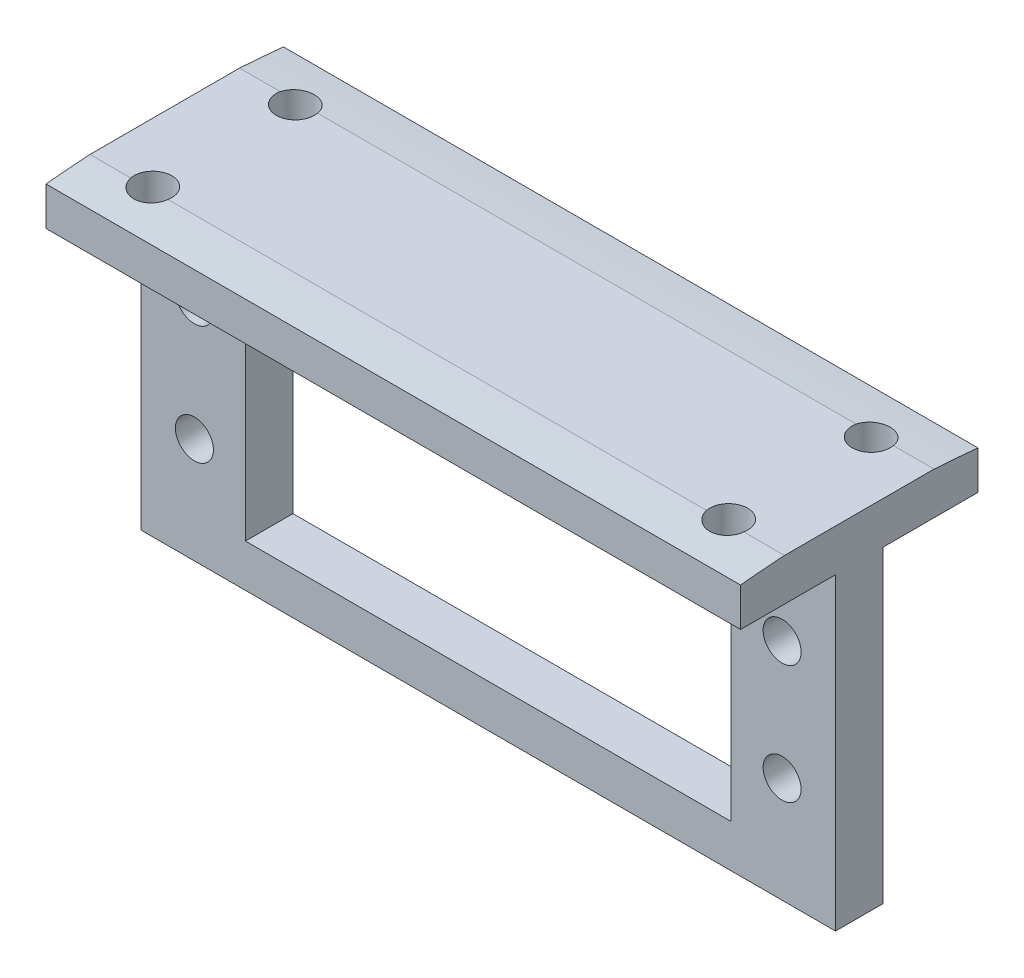
ISO-10303-21;
HEADER;
FILE_DESCRIPTION(('STEP AP214'),'2;1');
FILE_NAME('part.step','',(''),(''),'','','');
FILE_SCHEMA(('AUTOMOTIVE_DESIGN { 1 0 10303 214 1 1 1 1 }'));
ENDSEC;
DATA;
#1=APPLICATION_CONTEXT('core data for automotive mechanical design processes');
#2=APPLICATION_PROTOCOL_DEFINITION('international standard','automotive_design',2000,#1);
#3=PRODUCT_CONTEXT('',#1,'mechanical');
#4=PRODUCT('Part','Part','',(#3));
#5=PRODUCT_RELATED_PRODUCT_CATEGORY('part','',(#4));
#6=PRODUCT_DEFINITION_FORMATION('','',#4);
#7=PRODUCT_DEFINITION_CONTEXT('part definition',#1,'design');
#8=PRODUCT_DEFINITION('design','',#6,#7);
#9=PRODUCT_DEFINITION_SHAPE('','',#8);
#10=(LENGTH_UNIT() NAMED_UNIT(*) SI_UNIT(.MILLI.,.METRE.));
#11=(NAMED_UNIT(*) PLANE_ANGLE_UNIT() SI_UNIT($,.RADIAN.));
#12=(NAMED_UNIT(*) SI_UNIT($,.STERADIAN.) SOLID_ANGLE_UNIT());
#13=UNCERTAINTY_MEASURE_WITH_UNIT(LENGTH_MEASURE(1.E-05),#10,'distance_accuracy_value','');
#14=(GEOMETRIC_REPRESENTATION_CONTEXT(3) GLOBAL_UNCERTAINTY_ASSIGNED_CONTEXT((#13)) GLOBAL_UNIT_ASSIGNED_CONTEXT((#10,
#11,#12)) REPRESENTATION_CONTEXT('',''));
#15=CARTESIAN_POINT('',(0.,0.,0.));
#16=DIRECTION('',(0.,0.,1.));
#17=DIRECTION('',(1.,0.,0.));
#18=AXIS2_PLACEMENT_3D('',#15,#16,#17);
#19=CARTESIAN_POINT('',(-130.35,95.5,2.));
#20=DIRECTION('',(1.,0.,0.));
#21=DIRECTION('',(0.,0.,-1.));
#22=AXIS2_PLACEMENT_3D('',#19,#20,#21);
#23=PLANE('',#22);
#24=CARTESIAN_POINT('',(-130.35,0.,0.));
#25=DIRECTION('',(1.,0.,0.));
#26=DIRECTION('',(0.,0.,-1.));
#27=AXIS2_PLACEMENT_3D('',#24,#25,#26);
#28=CIRCLE('',#27,99.25);
#29=CARTESIAN_POINT('',(-130.35,98.7449365790469,-10.));
#30=VERTEX_POINT('',#29);
#31=CARTESIAN_POINT('',(-130.35,99.05,-6.29761859753368));
#32=VERTEX_POINT('',#31);
#33=EDGE_CURVE('E349',#30,#32,#28,.T.);
#34=ORIENTED_EDGE('',*,*,#33,.F.);
#35=DIRECTION('',(0.,-1.,0.));
#36=VECTOR('',#35,1.);
#37=CARTESIAN_POINT('',(-130.35,99.05,-10.));
#38=LINE('',#37,#36);
#39=CARTESIAN_POINT('',(-130.35,95.5,-10.));
#40=VERTEX_POINT('',#39);
#41=EDGE_CURVE('E193',#30,#40,#38,.T.);
#42=ORIENTED_EDGE('',*,*,#41,.T.);
#43=DIRECTION('',(0.,0.,-1.));
#44=VECTOR('',#43,1.);
#45=CARTESIAN_POINT('',(-130.35,95.5,10.));
#46=LINE('',#45,#44);
#47=CARTESIAN_POINT('',(-130.35,95.5,-2.));
#48=VERTEX_POINT('',#47);
#49=EDGE_CURVE('E223',#48,#40,#46,.T.);
#50=ORIENTED_EDGE('',*,*,#49,.F.);
#51=DIRECTION('',(0.,-1.,0.));
#52=VECTOR('',#51,1.);
#53=CARTESIAN_POINT('',(-130.35,95.5,-2.));
#54=LINE('',#53,#52);
#55=CARTESIAN_POINT('',(-130.35,69.5,-2.));
#56=VERTEX_POINT('',#55);
#57=EDGE_CURVE('E226',#48,#56,#54,.T.);
#58=ORIENTED_EDGE('',*,*,#57,.T.);
#59=DIRECTION('',(0.,0.,-1.));
#60=VECTOR('',#59,1.);
#61=CARTESIAN_POINT('',(-130.35,69.5,2.));
#62=LINE('',#61,#60);
#63=CARTESIAN_POINT('',(-130.35,69.5,2.));
#64=VERTEX_POINT('',#63);
#65=EDGE_CURVE('E255',#64,#56,#62,.T.);
#66=ORIENTED_EDGE('',*,*,#65,.F.);
#67=DIRECTION('',(0.,-1.,0.));
#68=VECTOR('',#67,1.);
#69=CARTESIAN_POINT('',(-130.35,95.5,2.));
#70=LINE('',#69,#68);
#71=CARTESIAN_POINT('',(-130.35,95.5,2.));
#72=VERTEX_POINT('',#71);
#73=EDGE_CURVE('E230',#72,#64,#70,.T.);
#74=ORIENTED_EDGE('',*,*,#73,.F.);
#75=CARTESIAN_POINT('',(-130.35,95.5,10.));
#76=VERTEX_POINT('',#75);
#77=EDGE_CURVE('E228',#76,#72,#46,.T.);
#78=ORIENTED_EDGE('',*,*,#77,.F.);
#79=DIRECTION('',(0.,-1.,0.));
#80=VECTOR('',#79,1.);
#81=CARTESIAN_POINT('',(-130.35,99.05,10.));
#82=LINE('',#81,#80);
#83=CARTESIAN_POINT('',(-130.35,98.7449365790469,10.));
#84=VERTEX_POINT('',#83);
#85=EDGE_CURVE('E202',#84,#76,#82,.T.);
#86=ORIENTED_EDGE('',*,*,#85,.F.);
#87=CARTESIAN_POINT('',(-130.35,99.05,6.29761859753368));
#88=VERTEX_POINT('',#87);
#89=EDGE_CURVE('E198',#88,#84,#28,.T.);
#90=ORIENTED_EDGE('',*,*,#89,.F.);
#91=DIRECTION('',(0.,0.,-1.));
#92=VECTOR('',#91,1.);
#93=CARTESIAN_POINT('',(-130.35,99.05,10.));
#94=LINE('',#93,#92);
#95=EDGE_CURVE('E209',#88,#32,#94,.T.);
#96=ORIENTED_EDGE('',*,*,#95,.T.);
#97=EDGE_LOOP('',(#34,#42,#50,#58,#66,#74,#78,#86,#90,#96));
#98=FACE_BOUND('',#97,.T.);
#99=ADVANCED_FACE('F41',(#98),#23,.F.);
#100=CARTESIAN_POINT('',(-71.85,69.5,2.));
#101=DIRECTION('',(-1.,0.,0.));
#102=DIRECTION('',(0.,0.,1.));
#103=AXIS2_PLACEMENT_3D('',#100,#101,#102);
#104=PLANE('',#103);
#105=CARTESIAN_POINT('',(-71.85,0.,0.));
#106=DIRECTION('',(-1.,0.,0.));
#107=DIRECTION('',(0.,0.,1.));
#108=AXIS2_PLACEMENT_3D('',#105,#106,#107);
#109=CIRCLE('',#108,99.25);
#110=CARTESIAN_POINT('',(-71.85,98.7449365790469,10.));
#111=VERTEX_POINT('',#110);
#112=CARTESIAN_POINT('',(-71.85,99.05,6.29761859753368));
#113=VERTEX_POINT('',#112);
#114=EDGE_CURVE('E386',#111,#113,#109,.T.);
#115=ORIENTED_EDGE('',*,*,#114,.F.);
#116=DIRECTION('',(0.,1.,0.));
#117=VECTOR('',#116,1.);
#118=CARTESIAN_POINT('',(-71.85,95.5,10.));
#119=LINE('',#118,#117);
#120=CARTESIAN_POINT('',(-71.85,95.5,10.));
#121=VERTEX_POINT('',#120);
#122=EDGE_CURVE('E207',#121,#111,#119,.T.);
#123=ORIENTED_EDGE('',*,*,#122,.F.);
#124=DIRECTION('',(0.,0.,-1.));
#125=VECTOR('',#124,1.);
#126=CARTESIAN_POINT('',(-71.85,95.5,10.));
#127=LINE('',#126,#125);
#128=CARTESIAN_POINT('',(-71.85,95.5,2.));
#129=VERTEX_POINT('',#128);
#130=EDGE_CURVE('E225',#121,#129,#127,.T.);
#131=ORIENTED_EDGE('',*,*,#130,.T.);
#132=DIRECTION('',(0.,1.,0.));
#133=VECTOR('',#132,1.);
#134=CARTESIAN_POINT('',(-71.85,69.5,2.));
#135=LINE('',#134,#133);
#136=CARTESIAN_POINT('',(-71.85,69.5,2.));
#137=VERTEX_POINT('',#136);
#138=EDGE_CURVE('E232',#137,#129,#135,.T.);
#139=ORIENTED_EDGE('',*,*,#138,.F.);
#140=DIRECTION('',(0.,0.,-1.));
#141=VECTOR('',#140,1.);
#142=CARTESIAN_POINT('',(-71.85,69.5,2.));
#143=LINE('',#142,#141);
#144=CARTESIAN_POINT('',(-71.85,69.5,-2.));
#145=VERTEX_POINT('',#144);
#146=EDGE_CURVE('E241',#137,#145,#143,.T.);
#147=ORIENTED_EDGE('',*,*,#146,.T.);
#148=DIRECTION('',(0.,1.,0.));
#149=VECTOR('',#148,1.);
#150=CARTESIAN_POINT('',(-71.85,69.5,-2.));
#151=LINE('',#150,#149);
#152=CARTESIAN_POINT('',(-71.85,95.5,-2.));
#153=VERTEX_POINT('',#152);
#154=EDGE_CURVE('E246',#145,#153,#151,.T.);
#155=ORIENTED_EDGE('',*,*,#154,.T.);
#156=CARTESIAN_POINT('',(-71.85,95.5,-10.));
#157=VERTEX_POINT('',#156);
#158=EDGE_CURVE('E222',#153,#157,#127,.T.);
#159=ORIENTED_EDGE('',*,*,#158,.T.);
#160=DIRECTION('',(0.,1.,0.));
#161=VECTOR('',#160,1.);
#162=CARTESIAN_POINT('',(-71.85,95.5,-10.));
#163=LINE('',#162,#161);
#164=CARTESIAN_POINT('',(-71.85,98.7449365790469,-10.));
#165=VERTEX_POINT('',#164);
#166=EDGE_CURVE('E201',#157,#165,#163,.T.);
#167=ORIENTED_EDGE('',*,*,#166,.T.);
#168=CARTESIAN_POINT('',(-71.85,99.05,-6.29761859753368));
#169=VERTEX_POINT('',#168);
#170=EDGE_CURVE('E356',#169,#165,#109,.T.);
#171=ORIENTED_EDGE('',*,*,#170,.F.);
#172=DIRECTION('',(0.,0.,-1.));
#173=VECTOR('',#172,1.);
#174=CARTESIAN_POINT('',(-71.85,99.05,10.));
#175=LINE('',#174,#173);
#176=EDGE_CURVE('E216',#113,#169,#175,.T.);
#177=ORIENTED_EDGE('',*,*,#176,.F.);
#178=EDGE_LOOP('',(#115,#123,#131,#139,#147,#155,#159,#167,#171,#177));
#179=FACE_BOUND('',#178,.T.);
#180=ADVANCED_FACE('F338',(#179),#104,.F.);
#181=CARTESIAN_POINT('',(-71.85,99.05,10.));
#182=DIRECTION('',(0.,-1.,0.));
#183=DIRECTION('',(0.,0.,-1.));
#184=AXIS2_PLACEMENT_3D('',#181,#182,#183);
#185=PLANE('',#184);
#186=DIRECTION('',(-1.,0.,0.));
#187=VECTOR('',#186,1.);
#188=CARTESIAN_POINT('',(-180.35,99.05,-6.29761859753368));
#189=LINE('',#188,#187);
#190=CARTESIAN_POINT('',(-123.77792392983,99.05,-6.29761859753368));
#191=VERTEX_POINT('',#190);
#192=CARTESIAN_POINT('',(-78.4220760701703,99.05,-6.29761859753369));
#193=VERTEX_POINT('',#192);
#194=EDGE_CURVE('E394',#191,#193,#189,.F.);
#195=ORIENTED_EDGE('',*,*,#194,.F.);
#196=CARTESIAN_POINT('',(-125.35,99.05,-6.));
#197=DIRECTION('',(0.,-1.,0.));
#198=DIRECTION('',(0.,0.,-1.));
#199=AXIS2_PLACEMENT_3D('',#196,#197,#198);
#200=CIRCLE('',#199,1.6);
#201=CARTESIAN_POINT('',(-126.92207607017,99.05,-6.29761859753369));
#202=VERTEX_POINT('',#201);
#203=EDGE_CURVE('E68',#191,#202,#200,.T.);
#204=ORIENTED_EDGE('',*,*,#203,.T.);
#205=EDGE_CURVE('E391',#32,#202,#189,.F.);
#206=ORIENTED_EDGE('',*,*,#205,.F.);
#207=ORIENTED_EDGE('',*,*,#95,.F.);
#208=DIRECTION('',(-1.,0.,0.));
#209=VECTOR('',#208,1.);
#210=CARTESIAN_POINT('',(-180.35,99.05,6.29761859753368));
#211=LINE('',#210,#209);
#212=CARTESIAN_POINT('',(-126.92207607017,99.05,6.29761859753368));
#213=VERTEX_POINT('',#212);
#214=EDGE_CURVE('E190',#213,#88,#211,.T.);
#215=ORIENTED_EDGE('',*,*,#214,.F.);
#216=CARTESIAN_POINT('',(-125.35,99.05,6.));
#217=DIRECTION('',(0.,-1.,0.));
#218=DIRECTION('',(0.,0.,-1.));
#219=AXIS2_PLACEMENT_3D('',#216,#217,#218);
#220=CIRCLE('',#219,1.6);
#221=CARTESIAN_POINT('',(-123.77792392983,99.05,6.29761859753367));
#222=VERTEX_POINT('',#221);
#223=EDGE_CURVE('E173',#213,#222,#220,.T.);
#224=ORIENTED_EDGE('',*,*,#223,.T.);
#225=CARTESIAN_POINT('',(-78.4220760701703,99.05,6.29761859753368));
#226=VERTEX_POINT('',#225);
#227=EDGE_CURVE('E184',#226,#222,#211,.T.);
#228=ORIENTED_EDGE('',*,*,#227,.F.);
#229=CARTESIAN_POINT('',(-76.85,99.05,6.));
#230=DIRECTION('',(0.,-1.,0.));
#231=DIRECTION('',(0.,0.,-1.));
#232=AXIS2_PLACEMENT_3D('',#229,#230,#231);
#233=CIRCLE('',#232,1.6);
#234=CARTESIAN_POINT('',(-75.2779239298297,99.05,6.29761859753367));
#235=VERTEX_POINT('',#234);
#236=EDGE_CURVE('E402',#226,#235,#233,.T.);
#237=ORIENTED_EDGE('',*,*,#236,.T.);
#238=EDGE_CURVE('E194',#113,#235,#211,.T.);
#239=ORIENTED_EDGE('',*,*,#238,.F.);
#240=ORIENTED_EDGE('',*,*,#176,.T.);
#241=CARTESIAN_POINT('',(-75.2779239298297,99.05,-6.29761859753368));
#242=VERTEX_POINT('',#241);
#243=EDGE_CURVE('E357',#242,#169,#189,.F.);
#244=ORIENTED_EDGE('',*,*,#243,.F.);
#245=CARTESIAN_POINT('',(-76.85,99.05,-6.));
#246=DIRECTION('',(0.,-1.,0.));
#247=DIRECTION('',(0.,0.,-1.));
#248=AXIS2_PLACEMENT_3D('',#245,#246,#247);
#249=CIRCLE('',#248,1.6);
#250=EDGE_CURVE('E58',#242,#193,#249,.T.);
#251=ORIENTED_EDGE('',*,*,#250,.T.);
#252=EDGE_LOOP('',(#195,#204,#206,#207,#215,#224,#228,#237,#239,#240,#244,#251));
#253=FACE_BOUND('',#252,.T.);
#254=ADVANCED_FACE('F182',(#253),#185,.F.);
#255=CARTESIAN_POINT('',(0.,0.,10.));
#256=DIRECTION('',(0.,0.,1.));
#257=DIRECTION('',(1.,0.,0.));
#258=AXIS2_PLACEMENT_3D('',#255,#256,#257);
#259=PLANE('',#258);
#260=ORIENTED_EDGE('',*,*,#122,.T.);
#261=DIRECTION('',(-1.,0.,0.));
#262=VECTOR('',#261,1.);
#263=CARTESIAN_POINT('',(-180.35,98.7449365790469,10.));
#264=LINE('',#263,#262);
#265=EDGE_CURVE('E199',#111,#84,#264,.T.);
#266=ORIENTED_EDGE('',*,*,#265,.T.);
#267=ORIENTED_EDGE('',*,*,#85,.T.);
#268=DIRECTION('',(1.,0.,0.));
#269=VECTOR('',#268,1.);
#270=CARTESIAN_POINT('',(-130.35,95.5,10.));
#271=LINE('',#270,#269);
#272=EDGE_CURVE('E204',#76,#121,#271,.T.);
#273=ORIENTED_EDGE('',*,*,#272,.T.);
#274=EDGE_LOOP('',(#260,#266,#267,#273));
#275=FACE_BOUND('',#274,.T.);
#276=ADVANCED_FACE('F395',(#275),#259,.T.);
#277=CARTESIAN_POINT('',(0.,0.,-10.));
#278=DIRECTION('',(0.,0.,1.));
#279=DIRECTION('',(1.,0.,0.));
#280=AXIS2_PLACEMENT_3D('',#277,#278,#279);
#281=PLANE('',#280);
#282=DIRECTION('',(-1.,0.,0.));
#283=VECTOR('',#282,1.);
#284=CARTESIAN_POINT('',(-180.35,98.7449365790469,-10.));
#285=LINE('',#284,#283);
#286=EDGE_CURVE('E253',#165,#30,#285,.T.);
#287=ORIENTED_EDGE('',*,*,#286,.F.);
#288=ORIENTED_EDGE('',*,*,#166,.F.);
#289=DIRECTION('',(1.,0.,0.));
#290=VECTOR('',#289,1.);
#291=CARTESIAN_POINT('',(-130.35,95.5,-10.));
#292=LINE('',#291,#290);
#293=EDGE_CURVE('E212',#40,#157,#292,.T.);
#294=ORIENTED_EDGE('',*,*,#293,.F.);
#295=ORIENTED_EDGE('',*,*,#41,.F.);
#296=EDGE_LOOP('',(#287,#288,#294,#295));
#297=FACE_BOUND('',#296,.T.);
#298=ADVANCED_FACE('F361',(#297),#281,.F.);
#299=CARTESIAN_POINT('',(-130.35,69.5,2.));
#300=DIRECTION('',(0.,1.,0.));
#301=DIRECTION('',(0.,0.,1.));
#302=AXIS2_PLACEMENT_3D('',#299,#300,#301);
#303=PLANE('',#302);
#304=DIRECTION('',(1.,0.,0.));
#305=VECTOR('',#304,1.);
#306=CARTESIAN_POINT('',(-130.35,69.5,-2.));
#307=LINE('',#306,#305);
#308=EDGE_CURVE('E242',#56,#145,#307,.T.);
#309=ORIENTED_EDGE('',*,*,#308,.T.);
#310=ORIENTED_EDGE('',*,*,#146,.F.);
#311=DIRECTION('',(1.,0.,0.));
#312=VECTOR('',#311,1.);
#313=CARTESIAN_POINT('',(-130.35,69.5,2.));
#314=LINE('',#313,#312);
#315=EDGE_CURVE('E235',#64,#137,#314,.T.);
#316=ORIENTED_EDGE('',*,*,#315,.F.);
#317=ORIENTED_EDGE('',*,*,#65,.T.);
#318=EDGE_LOOP('',(#309,#310,#316,#317));
#319=FACE_BOUND('',#318,.T.);
#320=ADVANCED_FACE('F374',(#319),#303,.F.);
#321=CARTESIAN_POINT('',(0.,0.,2.));
#322=DIRECTION('',(0.,0.,1.));
#323=DIRECTION('',(1.,0.,0.));
#324=AXIS2_PLACEMENT_3D('',#321,#322,#323);
#325=PLANE('',#324);
#326=CARTESIAN_POINT('',(-125.85,88.4,2.));
#327=DIRECTION('',(0.,0.,1.));
#328=DIRECTION('',(1.,0.,0.));
#329=AXIS2_PLACEMENT_3D('',#326,#327,#328);
#330=CIRCLE('',#329,1.6);
#331=CARTESIAN_POINT('',(-124.25,88.4,2.));
#332=VERTEX_POINT('',#331);
#333=EDGE_CURVE('E281',#332,#332,#330,.T.);
#334=ORIENTED_EDGE('',*,*,#333,.F.);
#335=EDGE_LOOP('',(#334));
#336=FACE_BOUND('',#335,.T.);
#337=CARTESIAN_POINT('',(-76.35,78.4,2.));
#338=DIRECTION('',(0.,0.,1.));
#339=DIRECTION('',(1.,0.,0.));
#340=AXIS2_PLACEMENT_3D('',#337,#338,#339);
#341=CIRCLE('',#340,1.6);
#342=CARTESIAN_POINT('',(-74.75,78.4,2.));
#343=VERTEX_POINT('',#342);
#344=EDGE_CURVE('E278',#343,#343,#341,.T.);
#345=ORIENTED_EDGE('',*,*,#344,.F.);
#346=EDGE_LOOP('',(#345));
#347=FACE_BOUND('',#346,.T.);
#348=CARTESIAN_POINT('',(-76.35,88.4,2.));
#349=DIRECTION('',(0.,0.,1.));
#350=DIRECTION('',(1.,0.,0.));
#351=AXIS2_PLACEMENT_3D('',#348,#349,#350);
#352=CIRCLE('',#351,1.6);
#353=CARTESIAN_POINT('',(-74.75,88.4,2.));
#354=VERTEX_POINT('',#353);
#355=EDGE_CURVE('E277',#354,#354,#352,.T.);
#356=ORIENTED_EDGE('',*,*,#355,.F.);
#357=EDGE_LOOP('',(#356));
#358=FACE_BOUND('',#357,.T.);
#359=CARTESIAN_POINT('',(-125.85,78.4,2.));
#360=DIRECTION('',(0.,0.,1.));
#361=DIRECTION('',(1.,0.,0.));
#362=AXIS2_PLACEMENT_3D('',#359,#360,#361);
#363=CIRCLE('',#362,1.6);
#364=CARTESIAN_POINT('',(-124.25,78.4,2.));
#365=VERTEX_POINT('',#364);
#366=EDGE_CURVE('E272',#365,#365,#363,.T.);
#367=ORIENTED_EDGE('',*,*,#366,.F.);
#368=EDGE_LOOP('',(#367));
#369=FACE_BOUND('',#368,.T.);
#370=DIRECTION('',(0.,-1.,0.));
#371=VECTOR('',#370,1.);
#372=CARTESIAN_POINT('',(-121.55,0.,2.));
#373=LINE('',#372,#371);
#374=CARTESIAN_POINT('',(-121.55,93.7,2.));
#375=VERTEX_POINT('',#374);
#376=CARTESIAN_POINT('',(-121.55,73.1,2.));
#377=VERTEX_POINT('',#376);
#378=EDGE_CURVE('E399',#375,#377,#373,.T.);
#379=ORIENTED_EDGE('',*,*,#378,.F.);
#380=DIRECTION('',(-1.,0.,0.));
#381=VECTOR('',#380,1.);
#382=CARTESIAN_POINT('',(0.,93.7,2.));
#383=LINE('',#382,#381);
#384=CARTESIAN_POINT('',(-80.65,93.7,2.));
#385=VERTEX_POINT('',#384);
#386=EDGE_CURVE('E404',#385,#375,#383,.T.);
#387=ORIENTED_EDGE('',*,*,#386,.F.);
#388=DIRECTION('',(0.,1.,0.));
#389=VECTOR('',#388,1.);
#390=CARTESIAN_POINT('',(-80.65,0.,2.));
#391=LINE('',#390,#389);
#392=CARTESIAN_POINT('',(-80.65,73.1,2.));
#393=VERTEX_POINT('',#392);
#394=EDGE_CURVE('E407',#393,#385,#391,.T.);
#395=ORIENTED_EDGE('',*,*,#394,.F.);
#396=DIRECTION('',(1.,0.,0.));
#397=VECTOR('',#396,1.);
#398=CARTESIAN_POINT('',(0.,73.1,2.));
#399=LINE('',#398,#397);
#400=EDGE_CURVE('E409',#377,#393,#399,.T.);
#401=ORIENTED_EDGE('',*,*,#400,.F.);
#402=EDGE_LOOP('',(#379,#387,#395,#401));
#403=FACE_BOUND('',#402,.T.);
#404=ORIENTED_EDGE('',*,*,#73,.T.);
#405=ORIENTED_EDGE('',*,*,#315,.T.);
#406=ORIENTED_EDGE('',*,*,#138,.T.);
#407=DIRECTION('',(-1.,0.,0.));
#408=VECTOR('',#407,1.);
#409=CARTESIAN_POINT('',(-71.85,95.5,2.));
#410=LINE('',#409,#408);
#411=EDGE_CURVE('E238',#129,#72,#410,.T.);
#412=ORIENTED_EDGE('',*,*,#411,.T.);
#413=EDGE_LOOP('',(#404,#405,#406,#412));
#414=FACE_BOUND('',#413,.T.);
#415=ADVANCED_FACE('F379',(#336,#347,#358,#369,#403,#414),#325,.T.);
#416=CARTESIAN_POINT('',(0.,0.,-2.));
#417=DIRECTION('',(0.,0.,1.));
#418=DIRECTION('',(1.,0.,0.));
#419=AXIS2_PLACEMENT_3D('',#416,#417,#418);
#420=PLANE('',#419);
#421=CARTESIAN_POINT('',(-125.85,88.4,-2.));
#422=DIRECTION('',(0.,0.,1.));
#423=DIRECTION('',(1.,0.,0.));
#424=AXIS2_PLACEMENT_3D('',#421,#422,#423);
#425=CIRCLE('',#424,1.6);
#426=CARTESIAN_POINT('',(-124.25,88.4,-2.));
#427=VERTEX_POINT('',#426);
#428=EDGE_CURVE('E283',#427,#427,#425,.T.);
#429=ORIENTED_EDGE('',*,*,#428,.T.);
#430=EDGE_LOOP('',(#429));
#431=FACE_BOUND('',#430,.T.);
#432=CARTESIAN_POINT('',(-76.35,78.4,-2.));
#433=DIRECTION('',(0.,0.,1.));
#434=DIRECTION('',(1.,0.,0.));
#435=AXIS2_PLACEMENT_3D('',#432,#433,#434);
#436=CIRCLE('',#435,1.6);
#437=CARTESIAN_POINT('',(-74.75,78.4,-2.));
#438=VERTEX_POINT('',#437);
#439=EDGE_CURVE('E280',#438,#438,#436,.T.);
#440=ORIENTED_EDGE('',*,*,#439,.T.);
#441=EDGE_LOOP('',(#440));
#442=FACE_BOUND('',#441,.T.);
#443=CARTESIAN_POINT('',(-76.35,88.4,-2.));
#444=DIRECTION('',(0.,0.,1.));
#445=DIRECTION('',(1.,0.,0.));
#446=AXIS2_PLACEMENT_3D('',#443,#444,#445);
#447=CIRCLE('',#446,1.6);
#448=CARTESIAN_POINT('',(-74.75,88.4,-2.));
#449=VERTEX_POINT('',#448);
#450=EDGE_CURVE('E271',#449,#449,#447,.T.);
#451=ORIENTED_EDGE('',*,*,#450,.T.);
#452=EDGE_LOOP('',(#451));
#453=FACE_BOUND('',#452,.T.);
#454=CARTESIAN_POINT('',(-125.85,78.4,-2.));
#455=DIRECTION('',(0.,0.,1.));
#456=DIRECTION('',(1.,0.,0.));
#457=AXIS2_PLACEMENT_3D('',#454,#455,#456);
#458=CIRCLE('',#457,1.6);
#459=CARTESIAN_POINT('',(-124.25,78.4,-2.));
#460=VERTEX_POINT('',#459);
#461=EDGE_CURVE('E269',#460,#460,#458,.T.);
#462=ORIENTED_EDGE('',*,*,#461,.T.);
#463=EDGE_LOOP('',(#462));
#464=FACE_BOUND('',#463,.T.);
#465=DIRECTION('',(-1.,0.,0.));
#466=VECTOR('',#465,1.);
#467=CARTESIAN_POINT('',(0.,93.7,-2.));
#468=LINE('',#467,#466);
#469=CARTESIAN_POINT('',(-80.65,93.7,-2.));
#470=VERTEX_POINT('',#469);
#471=CARTESIAN_POINT('',(-121.55,93.7,-2.));
#472=VERTEX_POINT('',#471);
#473=EDGE_CURVE('E261',#470,#472,#468,.T.);
#474=ORIENTED_EDGE('',*,*,#473,.T.);
#475=DIRECTION('',(0.,-1.,0.));
#476=VECTOR('',#475,1.);
#477=CARTESIAN_POINT('',(-121.55,0.,-2.));
#478=LINE('',#477,#476);
#479=CARTESIAN_POINT('',(-121.55,73.1,-2.));
#480=VERTEX_POINT('',#479);
#481=EDGE_CURVE('E178',#472,#480,#478,.T.);
#482=ORIENTED_EDGE('',*,*,#481,.T.);
#483=DIRECTION('',(1.,0.,0.));
#484=VECTOR('',#483,1.);
#485=CARTESIAN_POINT('',(0.,73.1,-2.));
#486=LINE('',#485,#484);
#487=CARTESIAN_POINT('',(-80.65,73.1,-2.));
#488=VERTEX_POINT('',#487);
#489=EDGE_CURVE('E260',#480,#488,#486,.T.);
#490=ORIENTED_EDGE('',*,*,#489,.T.);
#491=DIRECTION('',(0.,1.,0.));
#492=VECTOR('',#491,1.);
#493=CARTESIAN_POINT('',(-80.65,0.,-2.));
#494=LINE('',#493,#492);
#495=EDGE_CURVE('E258',#488,#470,#494,.T.);
#496=ORIENTED_EDGE('',*,*,#495,.T.);
#497=EDGE_LOOP('',(#474,#482,#490,#496));
#498=FACE_BOUND('',#497,.T.);
#499=ORIENTED_EDGE('',*,*,#57,.F.);
#500=DIRECTION('',(-1.,0.,0.));
#501=VECTOR('',#500,1.);
#502=CARTESIAN_POINT('',(-71.85,95.5,-2.));
#503=LINE('',#502,#501);
#504=EDGE_CURVE('E231',#153,#48,#503,.T.);
#505=ORIENTED_EDGE('',*,*,#504,.F.);
#506=ORIENTED_EDGE('',*,*,#154,.F.);
#507=ORIENTED_EDGE('',*,*,#308,.F.);
#508=EDGE_LOOP('',(#499,#505,#506,#507));
#509=FACE_BOUND('',#508,.T.);
#510=ADVANCED_FACE('F371',(#431,#442,#453,#464,#498,#509),#420,.F.);
#511=CARTESIAN_POINT('',(-130.35,95.5,10.));
#512=DIRECTION('',(0.,1.,0.));
#513=DIRECTION('',(0.,0.,1.));
#514=AXIS2_PLACEMENT_3D('',#511,#512,#513);
#515=PLANE('',#514);
#516=CARTESIAN_POINT('',(-125.35,95.5,-6.));
#517=DIRECTION('',(0.,1.,0.));
#518=DIRECTION('',(0.,0.,1.));
#519=AXIS2_PLACEMENT_3D('',#516,#517,#518);
#520=CIRCLE('',#519,1.6);
#521=CARTESIAN_POINT('',(-125.35,95.5,-4.4));
#522=VERTEX_POINT('',#521);
#523=EDGE_CURVE('E275',#522,#522,#520,.T.);
#524=ORIENTED_EDGE('',*,*,#523,.T.);
#525=EDGE_LOOP('',(#524));
#526=FACE_BOUND('',#525,.T.);
#527=CARTESIAN_POINT('',(-76.85,95.5,-6.));
#528=DIRECTION('',(0.,1.,0.));
#529=DIRECTION('',(0.,0.,1.));
#530=AXIS2_PLACEMENT_3D('',#527,#528,#529);
#531=CIRCLE('',#530,1.6);
#532=CARTESIAN_POINT('',(-76.85,95.5,-4.4));
#533=VERTEX_POINT('',#532);
#534=EDGE_CURVE('E435',#533,#533,#531,.T.);
#535=ORIENTED_EDGE('',*,*,#534,.T.);
#536=EDGE_LOOP('',(#535));
#537=FACE_BOUND('',#536,.T.);
#538=ORIENTED_EDGE('',*,*,#158,.F.);
#539=ORIENTED_EDGE('',*,*,#504,.T.);
#540=ORIENTED_EDGE('',*,*,#49,.T.);
#541=ORIENTED_EDGE('',*,*,#293,.T.);
#542=EDGE_LOOP('',(#538,#539,#540,#541));
#543=FACE_BOUND('',#542,.T.);
#544=ADVANCED_FACE('F366',(#526,#537,#543),#515,.F.);
#545=CARTESIAN_POINT('',(-76.85,95.5,6.));
#546=DIRECTION('',(0.,1.,0.));
#547=DIRECTION('',(0.,0.,1.));
#548=AXIS2_PLACEMENT_3D('',#545,#546,#547);
#549=CIRCLE('',#548,1.6);
#550=CARTESIAN_POINT('',(-76.85,95.5,7.6));
#551=VERTEX_POINT('',#550);
#552=EDGE_CURVE('E436',#551,#551,#549,.T.);
#553=ORIENTED_EDGE('',*,*,#552,.T.);
#554=EDGE_LOOP('',(#553));
#555=FACE_BOUND('',#554,.T.);
#556=CARTESIAN_POINT('',(-125.35,95.5,6.));
#557=DIRECTION('',(0.,1.,0.));
#558=DIRECTION('',(0.,0.,1.));
#559=AXIS2_PLACEMENT_3D('',#556,#557,#558);
#560=CIRCLE('',#559,1.6);
#561=CARTESIAN_POINT('',(-125.35,95.5,7.6));
#562=VERTEX_POINT('',#561);
#563=EDGE_CURVE('E189',#562,#562,#560,.T.);
#564=ORIENTED_EDGE('',*,*,#563,.T.);
#565=EDGE_LOOP('',(#564));
#566=FACE_BOUND('',#565,.T.);
#567=ORIENTED_EDGE('',*,*,#411,.F.);
#568=ORIENTED_EDGE('',*,*,#130,.F.);
#569=ORIENTED_EDGE('',*,*,#272,.F.);
#570=ORIENTED_EDGE('',*,*,#77,.T.);
#571=EDGE_LOOP('',(#567,#568,#569,#570));
#572=FACE_BOUND('',#571,.T.);
#573=ADVANCED_FACE('F381',(#555,#566,#572),#515,.F.);
#574=CARTESIAN_POINT('',(-180.35,0.,0.));
#575=DIRECTION('',(-1.,0.,0.));
#576=DIRECTION('',(0.,0.,1.));
#577=AXIS2_PLACEMENT_3D('',#574,#575,#576);
#578=CYLINDRICAL_SURFACE('',#577,99.25);
#579=CARTESIAN_POINT('',(-123.77792392983,99.05,-6.29761859753369));
#580=CARTESIAN_POINT('',(-123.786309398784,99.0471840868828,-6.34191026640534));
#581=CARTESIAN_POINT('',(-123.796563044776,99.0443619070697,-6.38582580299427));
#582=CARTESIAN_POINT('',(-123.82073591594,99.038726708505,-6.4726346225424));
#583=CARTESIAN_POINT('',(-123.83465497991,99.035913689356,-6.51552795036714));
#584=CARTESIAN_POINT('',(-123.881757513689,99.0275290804813,-6.64214648108054));
#585=CARTESIAN_POINT('',(-123.920312374313,99.0220032101248,-6.72394709471966));
#586=CARTESIAN_POINT('',(-124.010639594488,99.0112892971327,-6.87991481132045));
#587=CARTESIAN_POINT('',(-124.062418335231,99.0061014191168,-6.95407820462361));
#588=CARTESIAN_POINT('',(-124.177728192917,98.9962704310392,-7.09265599881403));
#589=CARTESIAN_POINT('',(-124.241256796182,98.9916272048052,-7.15707247953496));
#590=CARTESIAN_POINT('',(-124.37820303049,98.9830853001858,-7.27425485185302));
#591=CARTESIAN_POINT('',(-124.451610299374,98.9791858518432,-7.32703280056826));
#592=CARTESIAN_POINT('',(-124.606297950315,98.9722962719722,-7.41951679546684));
#593=CARTESIAN_POINT('',(-124.687579421517,98.9693062664737,-7.45922102996692));
#594=CARTESIAN_POINT('',(-124.855471325502,98.9643789471241,-7.52431185570541));
#595=CARTESIAN_POINT('',(-124.942067293941,98.9624389057452,-7.54973555056833));
#596=CARTESIAN_POINT('',(-125.118309479609,98.9596895886435,-7.58568820520606));
#597=CARTESIAN_POINT('',(-125.207955465177,98.9588802272366,-7.59621829363485));
#598=CARTESIAN_POINT('',(-125.387549672916,98.9584304780892,-7.60207513587987));
#599=CARTESIAN_POINT('',(-125.477496813744,98.9587875518344,-7.59743490486293));
#600=CARTESIAN_POINT('',(-125.655333910168,98.9606483799514,-7.57315771552215));
#601=CARTESIAN_POINT('',(-125.74322381481,98.9621521626933,-7.55352038616266));
#602=CARTESIAN_POINT('',(-125.914427127755,98.9662360453296,-7.49982280986452));
#603=CARTESIAN_POINT('',(-125.997741797093,98.9688158469472,-7.46576655986934));
#604=CARTESIAN_POINT('',(-126.157462264934,98.9749340401199,-7.38421258705555));
#605=CARTESIAN_POINT('',(-126.233868581968,98.9784723596502,-7.3367158741654));
#606=CARTESIAN_POINT('',(-126.377749908346,98.9863576763771,-7.22954887652299));
#607=CARTESIAN_POINT('',(-126.445210228298,98.9907059760958,-7.16985896884567));
#608=CARTESIAN_POINT('',(-126.569188417822,99.0000245625491,-7.04001860850428));
#609=CARTESIAN_POINT('',(-126.625701412186,99.0049951247832,-6.96986351985211));
#610=CARTESIAN_POINT('',(-126.726337816444,99.0153724270901,-6.82085925652929));
#611=CARTESIAN_POINT('',(-126.770418550299,99.0207805894995,-6.74198139847573));
#612=CARTESIAN_POINT('',(-126.844623824998,99.0318041150655,-6.57806710144639));
#613=CARTESIAN_POINT('',(-126.874775066259,99.0374190593515,-6.49304280913661));
#614=CARTESIAN_POINT('',(-126.907012895612,99.0453604835317,-6.37027485338928));
#615=CARTESIAN_POINT('',(-126.915186520507,99.0476835789861,-6.33405793095518));
#616=CARTESIAN_POINT('',(-126.92207607017,99.05,-6.29761859753369));
#617=B_SPLINE_CURVE_WITH_KNOTS('',3,(#579,#580,#581,#582,#583,#584,#585,#586,#587,#588,#589,
#590,#591,#592,#593,#594,#595,#596,#597,#598,#599,#600,#601,#602,#603,#604,#605,#606,#607,#608,
#609,#610,#611,#612,#613,#614,#615,#616),.UNSPECIFIED.,.F.,.F.,(4,2,2,2,2,2,2,2,2,2,2,2,2,2,2,2,
2,2,4),(0.,0.135415818963008,0.270825683433103,0.541231956469601,0.811768961591027,
1.08224815682811,1.3524458146538,1.62268089923982,1.89221057363896,2.16171982168627,
2.43064292751715,2.6995726868548,2.96842794727318,3.23726301102764,3.50653417781357,
3.77592498568289,4.04622957451581,4.31601386441142,4.42751834064796),.UNSPECIFIED.);
#618=EDGE_CURVE('E11',#191,#202,#617,.T.);
#619=ORIENTED_EDGE('',*,*,#618,.F.);
#620=ORIENTED_EDGE('',*,*,#194,.T.);
#621=CARTESIAN_POINT('',(-75.2779239298297,99.05,-6.29761859753369));
#622=CARTESIAN_POINT('',(-75.2863093987837,99.0471840868828,-6.34191026640534));
#623=CARTESIAN_POINT('',(-75.2965630447761,99.0443619070697,-6.38582580299427));
#624=CARTESIAN_POINT('',(-75.3207359159405,99.038726708505,-6.4726346225424));
#625=CARTESIAN_POINT('',(-75.3346549799101,99.035913689356,-6.51552795036714));
#626=CARTESIAN_POINT('',(-75.3817575136888,99.0275290804813,-6.64214648108055));
#627=CARTESIAN_POINT('',(-75.4203123743131,99.0220032101248,-6.72394709471967));
#628=CARTESIAN_POINT('',(-75.5106395944881,99.0112892971327,-6.87991481132044));
#629=CARTESIAN_POINT('',(-75.5624183352309,99.0061014191168,-6.95407820462361));
#630=CARTESIAN_POINT('',(-75.6777281929175,98.9962704310392,-7.09265599881403));
#631=CARTESIAN_POINT('',(-75.7412567961824,98.9916272048052,-7.15707247953496));
#632=CARTESIAN_POINT('',(-75.8782030304895,98.9830853001858,-7.27425485185302));
#633=CARTESIAN_POINT('',(-75.9516102993736,98.9791858518432,-7.32703280056826));
#634=CARTESIAN_POINT('',(-76.1062979503147,98.9722962719722,-7.41951679546684));
#635=CARTESIAN_POINT('',(-76.1875794215172,98.9693062664737,-7.45922102996692));
#636=CARTESIAN_POINT('',(-76.3554713255024,98.9643789471241,-7.52431185570541));
#637=CARTESIAN_POINT('',(-76.4420672939409,98.9624389057452,-7.54973555056833));
#638=CARTESIAN_POINT('',(-76.6183094796087,98.9596895886435,-7.58568820520606));
#639=CARTESIAN_POINT('',(-76.707955465177,98.9588802272366,-7.59621829363485));
#640=CARTESIAN_POINT('',(-76.8875496729159,98.9584304780892,-7.60207513587987));
#641=CARTESIAN_POINT('',(-76.977496813744,98.9587875518344,-7.59743490486293));
#642=CARTESIAN_POINT('',(-77.1553339101675,98.9606483799514,-7.57315771552215));
#643=CARTESIAN_POINT('',(-77.2432238148105,98.9621521626933,-7.55352038616265));
#644=CARTESIAN_POINT('',(-77.4144271277552,98.9662360453296,-7.49982280986452));
#645=CARTESIAN_POINT('',(-77.4977417970934,98.9688158469472,-7.46576655986933));
#646=CARTESIAN_POINT('',(-77.6574622649344,98.9749340401199,-7.38421258705553));
#647=CARTESIAN_POINT('',(-77.733868581968,98.9784723596502,-7.33671587416539));
#648=CARTESIAN_POINT('',(-77.8777499083456,98.9863576763771,-7.22954887652298));
#649=CARTESIAN_POINT('',(-77.9452102282977,98.9907059760958,-7.16985896884565));
#650=CARTESIAN_POINT('',(-78.0691884178216,99.0000245625491,-7.04001860850425));
#651=CARTESIAN_POINT('',(-78.1257014121864,99.0049951247832,-6.96986351985209));
#652=CARTESIAN_POINT('',(-78.226337816444,99.0153724270901,-6.82085925652928));
#653=CARTESIAN_POINT('',(-78.2704185502986,99.0207805894995,-6.74198139847571));
#654=CARTESIAN_POINT('',(-78.3446238249976,99.0318041150655,-6.57806710144637));
#655=CARTESIAN_POINT('',(-78.3747750662595,99.0374190593515,-6.49304280913659));
#656=CARTESIAN_POINT('',(-78.4070128956125,99.0453604835317,-6.37027485338927));
#657=CARTESIAN_POINT('',(-78.4151865205068,99.0476835789861,-6.33405793095518));
#658=CARTESIAN_POINT('',(-78.4220760701703,99.05,-6.29761859753368));
#659=B_SPLINE_CURVE_WITH_KNOTS('',3,(#621,#622,#623,#624,#625,#626,#627,#628,#629,#630,#631,
#632,#633,#634,#635,#636,#637,#638,#639,#640,#641,#642,#643,#644,#645,#646,#647,#648,#649,#650,
#651,#652,#653,#654,#655,#656,#657,#658),.UNSPECIFIED.,.F.,.F.,(4,2,2,2,2,2,2,2,2,2,2,2,2,2,2,2,
2,2,4),(0.,0.135415818963012,0.270825683433106,0.5412319564696,0.81176896159102,
1.08224815682811,1.3524458146538,1.62268089923982,1.89221057363895,2.16171982168629,
2.43064292751719,2.69957268685481,2.96842794727321,3.23726301102765,3.5065341778136,
3.7759249856829,4.04622957451583,4.31601386441144,4.42751834064796),.UNSPECIFIED.);
#660=EDGE_CURVE('E53',#242,#193,#659,.T.);
#661=ORIENTED_EDGE('',*,*,#660,.F.);
#662=ORIENTED_EDGE('',*,*,#243,.T.);
#663=ORIENTED_EDGE('',*,*,#170,.T.);
#664=ORIENTED_EDGE('',*,*,#286,.T.);
#665=ORIENTED_EDGE('',*,*,#33,.T.);
#666=ORIENTED_EDGE('',*,*,#205,.T.);
#667=EDGE_LOOP('',(#619,#620,#661,#662,#663,#664,#665,#666));
#668=FACE_BOUND('',#667,.T.);
#669=ADVANCED_FACE('F340',(#668),#578,.T.);
#670=CARTESIAN_POINT('',(-78.4220760701703,99.05,6.29761859753367));
#671=CARTESIAN_POINT('',(-78.4136906012163,99.0471840868828,6.34191026640533));
#672=CARTESIAN_POINT('',(-78.4034369552239,99.0443619070697,6.38582580299426));
#673=CARTESIAN_POINT('',(-78.3792640840595,99.038726708505,6.47263462254239));
#674=CARTESIAN_POINT('',(-78.3653450200899,99.035913689356,6.51552795036713));
#675=CARTESIAN_POINT('',(-78.3182424863111,99.0275290804813,6.64214648108054));
#676=CARTESIAN_POINT('',(-78.2796876256869,99.0220032101248,6.72394709471966));
#677=CARTESIAN_POINT('',(-78.1893604055119,99.0112892971327,6.87991481132044));
#678=CARTESIAN_POINT('',(-78.1375816647691,99.0061014191168,6.9540782046236));
#679=CARTESIAN_POINT('',(-78.0222718070825,98.9962704310392,7.09265599881403));
#680=CARTESIAN_POINT('',(-77.9587432038175,98.9916272048052,7.15707247953496));
#681=CARTESIAN_POINT('',(-77.8217969695104,98.9830853001858,7.27425485185302));
#682=CARTESIAN_POINT('',(-77.7483897006264,98.9791858518432,7.32703280056826));
#683=CARTESIAN_POINT('',(-77.5937020496853,98.9722962719722,7.41951679546684));
#684=CARTESIAN_POINT('',(-77.5124205784827,98.9693062664737,7.45922102996692));
#685=CARTESIAN_POINT('',(-77.3445286744975,98.9643789471241,7.52431185570541));
#686=CARTESIAN_POINT('',(-77.2579327060591,98.9624389057452,7.54973555056833));
#687=CARTESIAN_POINT('',(-77.0816905203913,98.9596895886435,7.58568820520606));
#688=CARTESIAN_POINT('',(-76.992044534823,98.9588802272366,7.59621829363485));
#689=CARTESIAN_POINT('',(-76.8124503270841,98.9584304780892,7.60207513587987));
#690=CARTESIAN_POINT('',(-76.722503186256,98.9587875518344,7.59743490486293));
#691=CARTESIAN_POINT('',(-76.5446660898324,98.9606483799514,7.57315771552215));
#692=CARTESIAN_POINT('',(-76.4567761851895,98.9621521626933,7.55352038616265));
#693=CARTESIAN_POINT('',(-76.2855728722447,98.9662360453296,7.49982280986452));
#694=CARTESIAN_POINT('',(-76.2022582029066,98.9688158469472,7.46576655986933));
#695=CARTESIAN_POINT('',(-76.0425377350656,98.9749340401199,7.38421258705553));
#696=CARTESIAN_POINT('',(-75.966131418032,98.9784723596502,7.33671587416539));
#697=CARTESIAN_POINT('',(-75.8222500916544,98.9863576763771,7.22954887652298));
#698=CARTESIAN_POINT('',(-75.7547897717023,98.9907059760958,7.16985896884565));
#699=CARTESIAN_POINT('',(-75.6308115821784,99.0000245625491,7.04001860850425));
#700=CARTESIAN_POINT('',(-75.5742985878136,99.0049951247832,6.96986351985209));
#701=CARTESIAN_POINT('',(-75.473662183556,99.0153724270901,6.82085925652928));
#702=CARTESIAN_POINT('',(-75.4295814497014,99.0207805894995,6.74198139847571));
#703=CARTESIAN_POINT('',(-75.3553761750024,99.0318041150655,6.57806710144637));
#704=CARTESIAN_POINT('',(-75.3252249337405,99.0374190593515,6.49304280913659));
#705=CARTESIAN_POINT('',(-75.2929871043875,99.0453604835317,6.37027485338926));
#706=CARTESIAN_POINT('',(-75.2848134794932,99.0476835789861,6.33405793095517));
#707=CARTESIAN_POINT('',(-75.2779239298297,99.05,6.29761859753367));
#708=B_SPLINE_CURVE_WITH_KNOTS('',3,(#670,#671,#672,#673,#674,#675,#676,#677,#678,#679,#680,
#681,#682,#683,#684,#685,#686,#687,#688,#689,#690,#691,#692,#693,#694,#695,#696,#697,#698,#699,
#700,#701,#702,#703,#704,#705,#706,#707),.UNSPECIFIED.,.F.,.F.,(4,2,2,2,2,2,2,2,2,2,2,2,2,2,2,2,
2,2,4),(0.,0.135415818963012,0.270825683433113,0.541231956469608,0.811768961591032,
1.08224815682812,1.35244581465381,1.62268089923983,1.89221057363897,2.1617198216863,
2.43064292751719,2.69957268685482,2.96842794727322,3.23726301102767,3.50653417781361,
3.77592498568292,4.04622957451585,4.31601386441145,4.42751834064798),.UNSPECIFIED.);
#709=EDGE_CURVE('E180',#226,#235,#708,.T.);
#710=ORIENTED_EDGE('',*,*,#709,.F.);
#711=ORIENTED_EDGE('',*,*,#227,.T.);
#712=CARTESIAN_POINT('',(-126.92207607017,99.05,6.29761859753367));
#713=CARTESIAN_POINT('',(-126.913690601216,99.0471840868828,6.34191026640533));
#714=CARTESIAN_POINT('',(-126.903436955224,99.0443619070697,6.38582580299426));
#715=CARTESIAN_POINT('',(-126.879264084059,99.038726708505,6.47263462254239));
#716=CARTESIAN_POINT('',(-126.86534502009,99.035913689356,6.51552795036713));
#717=CARTESIAN_POINT('',(-126.818242486311,99.0275290804813,6.64214648108054));
#718=CARTESIAN_POINT('',(-126.779687625687,99.0220032101248,6.72394709471966));
#719=CARTESIAN_POINT('',(-126.689360405512,99.0112892971327,6.87991481132043));
#720=CARTESIAN_POINT('',(-126.637581664769,99.0061014191168,6.95407820462359));
#721=CARTESIAN_POINT('',(-126.522271807083,98.9962704310392,7.09265599881401));
#722=CARTESIAN_POINT('',(-126.458743203818,98.9916272048053,7.15707247953494));
#723=CARTESIAN_POINT('',(-126.32179696951,98.9830853001858,7.27425485185301));
#724=CARTESIAN_POINT('',(-126.248389700626,98.9791858518432,7.32703280056824));
#725=CARTESIAN_POINT('',(-126.093702049685,98.9722962719722,7.41951679546682));
#726=CARTESIAN_POINT('',(-126.012420578483,98.9693062664737,7.45922102996691));
#727=CARTESIAN_POINT('',(-125.844528674498,98.9643789471242,7.5243118557054));
#728=CARTESIAN_POINT('',(-125.757932706059,98.9624389057452,7.54973555056833));
#729=CARTESIAN_POINT('',(-125.581690520391,98.9596895886435,7.58568820520606));
#730=CARTESIAN_POINT('',(-125.492044534823,98.9588802272366,7.59621829363485));
#731=CARTESIAN_POINT('',(-125.312450327084,98.9584304780892,7.60207513587987));
#732=CARTESIAN_POINT('',(-125.222503186256,98.9587875518344,7.59743490486293));
#733=CARTESIAN_POINT('',(-125.044666089832,98.9606483799514,7.57315771552216));
#734=CARTESIAN_POINT('',(-124.95677618519,98.9621521626933,7.55352038616266));
#735=CARTESIAN_POINT('',(-124.785572872245,98.9662360453296,7.49982280986452));
#736=CARTESIAN_POINT('',(-124.702258202907,98.9688158469472,7.46576655986934));
#737=CARTESIAN_POINT('',(-124.542537735066,98.9749340401199,7.38421258705555));
#738=CARTESIAN_POINT('',(-124.466131418032,98.9784723596502,7.33671587416541));
#739=CARTESIAN_POINT('',(-124.322250091654,98.9863576763771,7.229548876523));
#740=CARTESIAN_POINT('',(-124.254789771702,98.9907059760957,7.16985896884568));
#741=CARTESIAN_POINT('',(-124.130811582178,99.0000245625491,7.04001860850428));
#742=CARTESIAN_POINT('',(-124.074298587814,99.0049951247832,6.96986351985212));
#743=CARTESIAN_POINT('',(-123.973662183556,99.0153724270901,6.8208592565293));
#744=CARTESIAN_POINT('',(-123.929581449701,99.0207805894995,6.74198139847573));
#745=CARTESIAN_POINT('',(-123.855376175002,99.0318041150655,6.57806710144639));
#746=CARTESIAN_POINT('',(-123.82522493374,99.0374190593515,6.49304280913662));
#747=CARTESIAN_POINT('',(-123.792987104388,99.0453604835317,6.37027485338928));
#748=CARTESIAN_POINT('',(-123.784813479493,99.0476835789861,6.33405793095518));
#749=CARTESIAN_POINT('',(-123.77792392983,99.05,6.29761859753367));
#750=B_SPLINE_CURVE_WITH_KNOTS('',3,(#712,#713,#714,#715,#716,#717,#718,#719,#720,#721,#722,
#723,#724,#725,#726,#727,#728,#729,#730,#731,#732,#733,#734,#735,#736,#737,#738,#739,#740,#741,
#742,#743,#744,#745,#746,#747,#748,#749),.UNSPECIFIED.,.F.,.F.,(4,2,2,2,2,2,2,2,2,2,2,2,2,2,2,2,
2,2,4),(0.,0.13541581896301,0.270825683433106,0.541231956469592,0.811768961591008,
1.08224815682809,1.35244581465379,1.62268089923981,1.89221057363893,2.16171982168625,
2.43064292751716,2.6995726868548,2.96842794727319,3.23726301102763,3.50653417781355,
3.77592498568289,4.04622957451581,4.31601386441141,4.42751834064798),.UNSPECIFIED.);
#751=EDGE_CURVE('E169',#213,#222,#750,.T.);
#752=ORIENTED_EDGE('',*,*,#751,.F.);
#753=ORIENTED_EDGE('',*,*,#214,.T.);
#754=ORIENTED_EDGE('',*,*,#89,.T.);
#755=ORIENTED_EDGE('',*,*,#265,.F.);
#756=ORIENTED_EDGE('',*,*,#114,.T.);
#757=ORIENTED_EDGE('',*,*,#238,.T.);
#758=EDGE_LOOP('',(#710,#711,#752,#753,#754,#755,#756,#757));
#759=FACE_BOUND('',#758,.T.);
#760=ADVANCED_FACE('F192',(#759),#578,.T.);
#761=CARTESIAN_POINT('',(-121.55,93.7,-3.));
#762=DIRECTION('',(-1.,0.,0.));
#763=DIRECTION('',(0.,0.,1.));
#764=AXIS2_PLACEMENT_3D('',#761,#762,#763);
#765=PLANE('',#764);
#766=ORIENTED_EDGE('',*,*,#378,.T.);
#767=DIRECTION('',(0.,0.,1.));
#768=VECTOR('',#767,1.);
#769=CARTESIAN_POINT('',(-121.55,73.1,-3.));
#770=LINE('',#769,#768);
#771=EDGE_CURVE('E413',#480,#377,#770,.T.);
#772=ORIENTED_EDGE('',*,*,#771,.F.);
#773=ORIENTED_EDGE('',*,*,#481,.F.);
#774=DIRECTION('',(0.,0.,1.));
#775=VECTOR('',#774,1.);
#776=CARTESIAN_POINT('',(-121.55,93.7,-3.));
#777=LINE('',#776,#775);
#778=EDGE_CURVE('E408',#472,#375,#777,.T.);
#779=ORIENTED_EDGE('',*,*,#778,.T.);
#780=EDGE_LOOP('',(#766,#772,#773,#779));
#781=FACE_BOUND('',#780,.T.);
#782=ADVANCED_FACE('F321',(#781),#765,.F.);
#783=CARTESIAN_POINT('',(-80.65,93.7,-3.));
#784=DIRECTION('',(0.,1.,0.));
#785=DIRECTION('',(0.,0.,1.));
#786=AXIS2_PLACEMENT_3D('',#783,#784,#785);
#787=PLANE('',#786);
#788=ORIENTED_EDGE('',*,*,#386,.T.);
#789=ORIENTED_EDGE('',*,*,#778,.F.);
#790=ORIENTED_EDGE('',*,*,#473,.F.);
#791=DIRECTION('',(0.,0.,1.));
#792=VECTOR('',#791,1.);
#793=CARTESIAN_POINT('',(-80.65,93.7,-3.));
#794=LINE('',#793,#792);
#795=EDGE_CURVE('E417',#470,#385,#794,.T.);
#796=ORIENTED_EDGE('',*,*,#795,.T.);
#797=EDGE_LOOP('',(#788,#789,#790,#796));
#798=FACE_BOUND('',#797,.T.);
#799=ADVANCED_FACE('F318',(#798),#787,.F.);
#800=CARTESIAN_POINT('',(-80.65,73.1,-3.));
#801=DIRECTION('',(1.,0.,0.));
#802=DIRECTION('',(0.,0.,-1.));
#803=AXIS2_PLACEMENT_3D('',#800,#801,#802);
#804=PLANE('',#803);
#805=ORIENTED_EDGE('',*,*,#394,.T.);
#806=ORIENTED_EDGE('',*,*,#795,.F.);
#807=ORIENTED_EDGE('',*,*,#495,.F.);
#808=DIRECTION('',(0.,0.,1.));
#809=VECTOR('',#808,1.);
#810=CARTESIAN_POINT('',(-80.65,73.1,-3.));
#811=LINE('',#810,#809);
#812=EDGE_CURVE('E411',#488,#393,#811,.T.);
#813=ORIENTED_EDGE('',*,*,#812,.T.);
#814=EDGE_LOOP('',(#805,#806,#807,#813));
#815=FACE_BOUND('',#814,.T.);
#816=ADVANCED_FACE('F324',(#815),#804,.F.);
#817=CARTESIAN_POINT('',(-121.55,73.1,-3.));
#818=DIRECTION('',(0.,-1.,0.));
#819=DIRECTION('',(0.,0.,-1.));
#820=AXIS2_PLACEMENT_3D('',#817,#818,#819);
#821=PLANE('',#820);
#822=ORIENTED_EDGE('',*,*,#400,.T.);
#823=ORIENTED_EDGE('',*,*,#812,.F.);
#824=ORIENTED_EDGE('',*,*,#489,.F.);
#825=ORIENTED_EDGE('',*,*,#771,.T.);
#826=EDGE_LOOP('',(#822,#823,#824,#825));
#827=FACE_BOUND('',#826,.T.);
#828=ADVANCED_FACE('F319',(#827),#821,.F.);
#829=CARTESIAN_POINT('',(-125.85,78.4,-3.));
#830=DIRECTION('',(0.,0.,1.));
#831=DIRECTION('',(1.,0.,0.));
#832=AXIS2_PLACEMENT_3D('',#829,#830,#831);
#833=CYLINDRICAL_SURFACE('',#832,1.6);
#834=ORIENTED_EDGE('',*,*,#366,.T.);
#835=EDGE_LOOP('',(#834));
#836=FACE_BOUND('',#835,.T.);
#837=ORIENTED_EDGE('',*,*,#461,.F.);
#838=EDGE_LOOP('',(#837));
#839=FACE_BOUND('',#838,.T.);
#840=ADVANCED_FACE('F308',(#836,#839),#833,.F.);
#841=CARTESIAN_POINT('',(-76.35,88.4,-3.));
#842=DIRECTION('',(0.,0.,1.));
#843=DIRECTION('',(1.,0.,0.));
#844=AXIS2_PLACEMENT_3D('',#841,#842,#843);
#845=CYLINDRICAL_SURFACE('',#844,1.6);
#846=ORIENTED_EDGE('',*,*,#355,.T.);
#847=EDGE_LOOP('',(#846));
#848=FACE_BOUND('',#847,.T.);
#849=ORIENTED_EDGE('',*,*,#450,.F.);
#850=EDGE_LOOP('',(#849));
#851=FACE_BOUND('',#850,.T.);
#852=ADVANCED_FACE('F302',(#848,#851),#845,.F.);
#853=CARTESIAN_POINT('',(-76.35,78.4,-3.));
#854=DIRECTION('',(0.,0.,1.));
#855=DIRECTION('',(1.,0.,0.));
#856=AXIS2_PLACEMENT_3D('',#853,#854,#855);
#857=CYLINDRICAL_SURFACE('',#856,1.6);
#858=ORIENTED_EDGE('',*,*,#344,.T.);
#859=EDGE_LOOP('',(#858));
#860=FACE_BOUND('',#859,.T.);
#861=ORIENTED_EDGE('',*,*,#439,.F.);
#862=EDGE_LOOP('',(#861));
#863=FACE_BOUND('',#862,.T.);
#864=ADVANCED_FACE('F310',(#860,#863),#857,.F.);
#865=CARTESIAN_POINT('',(-125.85,88.4,-3.));
#866=DIRECTION('',(0.,0.,1.));
#867=DIRECTION('',(1.,0.,0.));
#868=AXIS2_PLACEMENT_3D('',#865,#866,#867);
#869=CYLINDRICAL_SURFACE('',#868,1.6);
#870=ORIENTED_EDGE('',*,*,#333,.T.);
#871=EDGE_LOOP('',(#870));
#872=FACE_BOUND('',#871,.T.);
#873=ORIENTED_EDGE('',*,*,#428,.F.);
#874=EDGE_LOOP('',(#873));
#875=FACE_BOUND('',#874,.T.);
#876=ADVANCED_FACE('F305',(#872,#875),#869,.F.);
#877=CARTESIAN_POINT('',(-125.35,-104.05,6.));
#878=DIRECTION('',(0.,1.,0.));
#879=DIRECTION('',(0.,0.,1.));
#880=AXIS2_PLACEMENT_3D('',#877,#878,#879);
#881=CYLINDRICAL_SURFACE('',#880,1.6);
#882=ORIENTED_EDGE('',*,*,#751,.T.);
#883=ORIENTED_EDGE('',*,*,#223,.F.);
#884=EDGE_LOOP('',(#882,#883));
#885=FACE_BOUND('',#884,.T.);
#886=ORIENTED_EDGE('',*,*,#563,.F.);
#887=EDGE_LOOP('',(#886));
#888=FACE_BOUND('',#887,.T.);
#889=ADVANCED_FACE('F171',(#885,#888),#881,.F.);
#890=CARTESIAN_POINT('',(-76.85,-104.05,6.));
#891=DIRECTION('',(0.,1.,0.));
#892=DIRECTION('',(0.,0.,1.));
#893=AXIS2_PLACEMENT_3D('',#890,#891,#892);
#894=CYLINDRICAL_SURFACE('',#893,1.6);
#895=ORIENTED_EDGE('',*,*,#709,.T.);
#896=ORIENTED_EDGE('',*,*,#236,.F.);
#897=EDGE_LOOP('',(#895,#896));
#898=FACE_BOUND('',#897,.T.);
#899=ORIENTED_EDGE('',*,*,#552,.F.);
#900=EDGE_LOOP('',(#899));
#901=FACE_BOUND('',#900,.T.);
#902=ADVANCED_FACE('F301',(#898,#901),#894,.F.);
#903=CARTESIAN_POINT('',(-76.85,-104.05,-6.));
#904=DIRECTION('',(0.,1.,0.));
#905=DIRECTION('',(0.,0.,1.));
#906=AXIS2_PLACEMENT_3D('',#903,#904,#905);
#907=CYLINDRICAL_SURFACE('',#906,1.6);
#908=ORIENTED_EDGE('',*,*,#660,.T.);
#909=ORIENTED_EDGE('',*,*,#250,.F.);
#910=EDGE_LOOP('',(#908,#909));
#911=FACE_BOUND('',#910,.T.);
#912=ORIENTED_EDGE('',*,*,#534,.F.);
#913=EDGE_LOOP('',(#912));
#914=FACE_BOUND('',#913,.T.);
#915=ADVANCED_FACE('F570',(#911,#914),#907,.F.);
#916=CARTESIAN_POINT('',(-125.35,-104.05,-6.));
#917=DIRECTION('',(0.,1.,0.));
#918=DIRECTION('',(0.,0.,1.));
#919=AXIS2_PLACEMENT_3D('',#916,#917,#918);
#920=CYLINDRICAL_SURFACE('',#919,1.6);
#921=ORIENTED_EDGE('',*,*,#618,.T.);
#922=ORIENTED_EDGE('',*,*,#203,.F.);
#923=EDGE_LOOP('',(#921,#922));
#924=FACE_BOUND('',#923,.T.);
#925=ORIENTED_EDGE('',*,*,#523,.F.);
#926=EDGE_LOOP('',(#925));
#927=FACE_BOUND('',#926,.T.);
#928=ADVANCED_FACE('F574',(#924,#927),#920,.F.);
#929=CLOSED_SHELL('',(#99,#180,#254,#276,#298,#320,#415,#510,#544,#573,#669,#760,#782,#799,#816,
#828,#840,#852,#864,#876,#889,#902,#915,#928));
#930=MANIFOLD_SOLID_BREP('B2',#929);
#931=ADVANCED_BREP_SHAPE_REPRESENTATION('',(#18,#930),#14);
#932=SHAPE_DEFINITION_REPRESENTATION(#9,#931);
ENDSEC;
END-ISO-10303-21;
